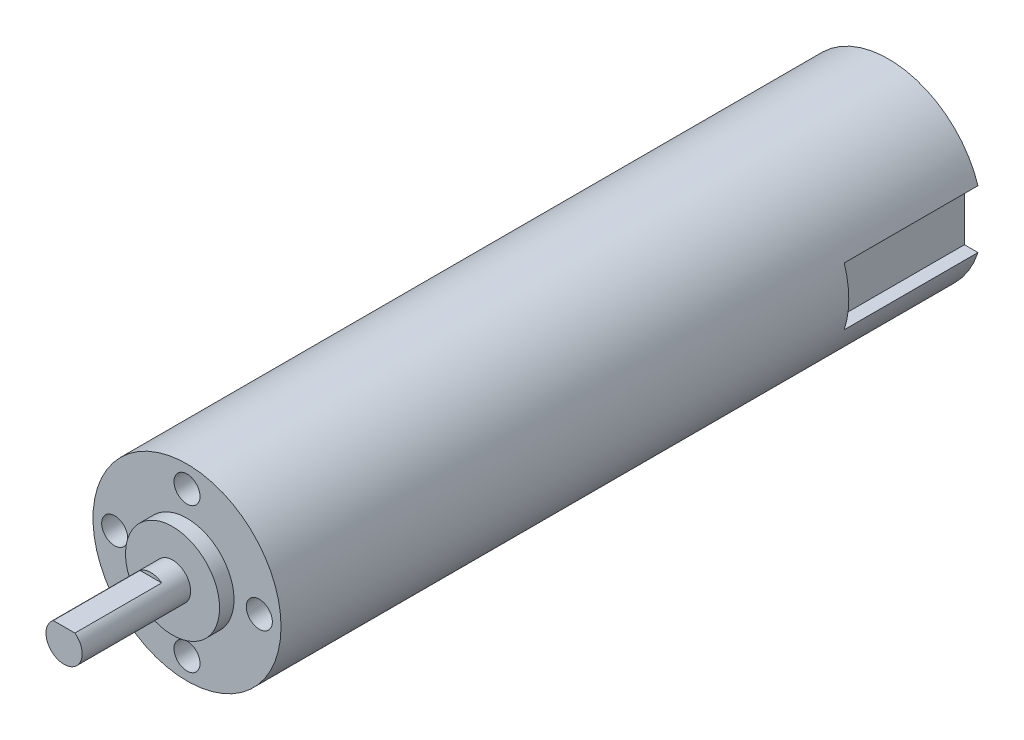
ISO-10303-21;
HEADER;
FILE_DESCRIPTION(('STEP AP214'),'2;1');
FILE_NAME('part.step','',(''),(''),'','','');
FILE_SCHEMA(('AUTOMOTIVE_DESIGN { 1 0 10303 214 1 1 1 1 }'));
ENDSEC;
DATA;
#1=APPLICATION_CONTEXT('core data for automotive mechanical design processes');
#2=APPLICATION_PROTOCOL_DEFINITION('international standard','automotive_design',2000,#1);
#3=PRODUCT_CONTEXT('',#1,'mechanical');
#4=PRODUCT('Part','Part','',(#3));
#5=PRODUCT_RELATED_PRODUCT_CATEGORY('part','',(#4));
#6=PRODUCT_DEFINITION_FORMATION('','',#4);
#7=PRODUCT_DEFINITION_CONTEXT('part definition',#1,'design');
#8=PRODUCT_DEFINITION('design','',#6,#7);
#9=PRODUCT_DEFINITION_SHAPE('','',#8);
#10=(LENGTH_UNIT() NAMED_UNIT(*) SI_UNIT(.MILLI.,.METRE.));
#11=(NAMED_UNIT(*) PLANE_ANGLE_UNIT() SI_UNIT($,.RADIAN.));
#12=(NAMED_UNIT(*) SI_UNIT($,.STERADIAN.) SOLID_ANGLE_UNIT());
#13=UNCERTAINTY_MEASURE_WITH_UNIT(LENGTH_MEASURE(1.E-05),#10,'distance_accuracy_value','');
#14=(GEOMETRIC_REPRESENTATION_CONTEXT(3) GLOBAL_UNCERTAINTY_ASSIGNED_CONTEXT((#13)) GLOBAL_UNIT_ASSIGNED_CONTEXT((#10,
#11,#12)) REPRESENTATION_CONTEXT('',''));
#15=CARTESIAN_POINT('',(0.,0.,0.));
#16=DIRECTION('',(0.,0.,1.));
#17=DIRECTION('',(1.,0.,0.));
#18=AXIS2_PLACEMENT_3D('',#15,#16,#17);
#19=CARTESIAN_POINT('',(0.,0.,100.));
#20=DIRECTION('',(0.,0.,-1.));
#21=DIRECTION('',(-1.,0.,0.));
#22=AXIS2_PLACEMENT_3D('',#19,#20,#21);
#23=CYLINDRICAL_SURFACE('',#22,2.49680534345229);
#24=CARTESIAN_POINT('',(0.,0.,100.));
#25=DIRECTION('',(0.,0.,1.));
#26=DIRECTION('',(1.,0.,0.));
#27=AXIS2_PLACEMENT_3D('',#24,#25,#26);
#28=CIRCLE('',#27,2.49680534345229);
#29=CARTESIAN_POINT('',(2.49680534345229,0.,100.));
#30=VERTEX_POINT('',#29);
#31=EDGE_CURVE('E11',#30,#30,#28,.T.);
#32=ORIENTED_EDGE('',*,*,#31,.F.);
#33=EDGE_LOOP('',(#32));
#34=FACE_BOUND('',#33,.T.);
#35=CARTESIAN_POINT('',(0.,0.,97.));
#36=DIRECTION('',(0.,0.,1.));
#37=DIRECTION('',(1.,0.,0.));
#38=AXIS2_PLACEMENT_3D('',#35,#36,#37);
#39=CIRCLE('',#38,2.49680534345229);
#40=CARTESIAN_POINT('',(2.49680534345229,0.,97.));
#41=VERTEX_POINT('',#40);
#42=EDGE_CURVE('E49',#41,#41,#39,.T.);
#43=ORIENTED_EDGE('',*,*,#42,.T.);
#44=EDGE_LOOP('',(#43));
#45=FACE_BOUND('',#44,.T.);
#46=ADVANCED_FACE('F46',(#34,#45),#23,.T.);
#47=CARTESIAN_POINT('',(0.,0.,100.));
#48=DIRECTION('',(0.,0.,1.));
#49=DIRECTION('',(1.,0.,0.));
#50=AXIS2_PLACEMENT_3D('',#47,#48,#49);
#51=PLANE('',#50);
#52=ORIENTED_EDGE('',*,*,#31,.T.);
#53=EDGE_LOOP('',(#52));
#54=FACE_BOUND('',#53,.T.);
#55=ADVANCED_FACE('F61',(#54),#51,.T.);
#56=CARTESIAN_POINT('',(0.,0.,97.));
#57=DIRECTION('',(0.,0.,1.));
#58=DIRECTION('',(1.,0.,0.));
#59=AXIS2_PLACEMENT_3D('',#56,#57,#58);
#60=PLANE('',#59);
#61=ORIENTED_EDGE('',*,*,#42,.F.);
#62=EDGE_LOOP('',(#61));
#63=FACE_BOUND('',#62,.T.);
#64=ADVANCED_FACE('F59',(#63),#60,.F.);
#65=CLOSED_SHELL('',(#46,#55,#64));
#66=MANIFOLD_SOLID_BREP('B2',#65);
#67=CARTESIAN_POINT('',(0.,0.,97.));
#68=DIRECTION('',(0.,0.,1.));
#69=DIRECTION('',(1.,0.,0.));
#70=AXIS2_PLACEMENT_3D('',#67,#68,#69);
#71=PLANE('',#70);
#72=CARTESIAN_POINT('',(0.,10.,97.));
#73=DIRECTION('',(0.,0.,1.));
#74=DIRECTION('',(1.,0.,0.));
#75=AXIS2_PLACEMENT_3D('',#72,#73,#74);
#76=CIRCLE('',#75,1.8);
#77=CARTESIAN_POINT('',(1.8,10.,97.));
#78=VERTEX_POINT('',#77);
#79=EDGE_CURVE('E191',#78,#78,#76,.T.);
#80=ORIENTED_EDGE('',*,*,#79,.F.);
#81=EDGE_LOOP('',(#80));
#82=FACE_BOUND('',#81,.T.);
#83=CARTESIAN_POINT('',(-10.,0.,97.));
#84=DIRECTION('',(0.,0.,1.));
#85=DIRECTION('',(1.,0.,0.));
#86=AXIS2_PLACEMENT_3D('',#83,#84,#85);
#87=CIRCLE('',#86,1.8);
#88=CARTESIAN_POINT('',(-8.2,0.,97.));
#89=VERTEX_POINT('',#88);
#90=EDGE_CURVE('E197',#89,#89,#87,.T.);
#91=ORIENTED_EDGE('',*,*,#90,.F.);
#92=EDGE_LOOP('',(#91));
#93=FACE_BOUND('',#92,.T.);
#94=CARTESIAN_POINT('',(0.,-10.,97.));
#95=DIRECTION('',(0.,0.,1.));
#96=DIRECTION('',(1.,0.,0.));
#97=AXIS2_PLACEMENT_3D('',#94,#95,#96);
#98=CIRCLE('',#97,1.8);
#99=CARTESIAN_POINT('',(1.8,-10.,97.));
#100=VERTEX_POINT('',#99);
#101=EDGE_CURVE('E203',#100,#100,#98,.T.);
#102=ORIENTED_EDGE('',*,*,#101,.F.);
#103=EDGE_LOOP('',(#102));
#104=FACE_BOUND('',#103,.T.);
#105=CARTESIAN_POINT('',(10.,0.,97.));
#106=DIRECTION('',(0.,0.,1.));
#107=DIRECTION('',(1.,0.,0.));
#108=AXIS2_PLACEMENT_3D('',#105,#106,#107);
#109=CIRCLE('',#108,1.8);
#110=CARTESIAN_POINT('',(11.8,0.,97.));
#111=VERTEX_POINT('',#110);
#112=EDGE_CURVE('E179',#111,#111,#109,.T.);
#113=ORIENTED_EDGE('',*,*,#112,.F.);
#114=EDGE_LOOP('',(#113));
#115=FACE_BOUND('',#114,.T.);
#116=CARTESIAN_POINT('',(0.,0.,97.));
#117=DIRECTION('',(0.,0.,1.));
#118=DIRECTION('',(1.,0.,0.));
#119=AXIS2_PLACEMENT_3D('',#116,#117,#118);
#120=CIRCLE('',#119,13.);
#121=CARTESIAN_POINT('',(13.,0.,97.));
#122=VERTEX_POINT('',#121);
#123=EDGE_CURVE('E44',#122,#122,#120,.T.);
#124=ORIENTED_EDGE('',*,*,#123,.T.);
#125=EDGE_LOOP('',(#124));
#126=FACE_BOUND('',#125,.T.);
#127=CARTESIAN_POINT('',(0.,0.,97.));
#128=DIRECTION('',(0.,0.,1.));
#129=DIRECTION('',(1.,0.,0.));
#130=AXIS2_PLACEMENT_3D('',#127,#128,#129);
#131=CIRCLE('',#130,6.5);
#132=CARTESIAN_POINT('',(6.5,0.,97.));
#133=VERTEX_POINT('',#132);
#134=EDGE_CURVE('E210',#133,#133,#131,.T.);
#135=ORIENTED_EDGE('',*,*,#134,.F.);
#136=EDGE_LOOP('',(#135));
#137=FACE_BOUND('',#136,.T.);
#138=ADVANCED_FACE('F86',(#82,#93,#104,#115,#126,#137),#71,.T.);
#139=CARTESIAN_POINT('',(0.,0.,97.));
#140=DIRECTION('',(0.,0.,-1.));
#141=DIRECTION('',(-1.,0.,0.));
#142=AXIS2_PLACEMENT_3D('',#139,#140,#141);
#143=CYLINDRICAL_SURFACE('',#142,13.);
#144=CARTESIAN_POINT('',(0.,0.,18.5));
#145=DIRECTION('',(0.,0.,-1.));
#146=DIRECTION('',(-1.,0.,0.));
#147=AXIS2_PLACEMENT_3D('',#144,#145,#146);
#148=CIRCLE('',#147,13.);
#149=CARTESIAN_POINT('',(12.369316876853,4.,18.5));
#150=VERTEX_POINT('',#149);
#151=CARTESIAN_POINT('',(12.369316876853,-4.,18.5));
#152=VERTEX_POINT('',#151);
#153=EDGE_CURVE('E217',#150,#152,#148,.T.);
#154=ORIENTED_EDGE('',*,*,#153,.F.);
#155=DIRECTION('',(0.,0.,-1.));
#156=VECTOR('',#155,1.);
#157=CARTESIAN_POINT('',(12.369316876853,4.,18.5));
#158=LINE('',#157,#156);
#159=CARTESIAN_POINT('',(12.369316876853,4.,0.));
#160=VERTEX_POINT('',#159);
#161=EDGE_CURVE('E238',#150,#160,#158,.T.);
#162=ORIENTED_EDGE('',*,*,#161,.T.);
#163=CARTESIAN_POINT('',(0.,0.,0.));
#164=DIRECTION('',(0.,0.,1.));
#165=DIRECTION('',(1.,0.,0.));
#166=AXIS2_PLACEMENT_3D('',#163,#164,#165);
#167=CIRCLE('',#166,13.);
#168=CARTESIAN_POINT('',(-12.369316876853,4.,0.));
#169=VERTEX_POINT('',#168);
#170=EDGE_CURVE('E90',#160,#169,#167,.T.);
#171=ORIENTED_EDGE('',*,*,#170,.T.);
#172=DIRECTION('',(0.,0.,-1.));
#173=VECTOR('',#172,1.);
#174=CARTESIAN_POINT('',(-12.369316876853,4.,18.5));
#175=LINE('',#174,#173);
#176=CARTESIAN_POINT('',(-12.369316876853,4.,18.5));
#177=VERTEX_POINT('',#176);
#178=EDGE_CURVE('E265',#177,#169,#175,.T.);
#179=ORIENTED_EDGE('',*,*,#178,.F.);
#180=CARTESIAN_POINT('',(0.,0.,18.5));
#181=DIRECTION('',(0.,0.,-1.));
#182=DIRECTION('',(1.,0.,0.));
#183=AXIS2_PLACEMENT_3D('',#180,#181,#182);
#184=CIRCLE('',#183,13.);
#185=CARTESIAN_POINT('',(-12.3650078174607,-4.01330059603498,18.5));
#186=VERTEX_POINT('',#185);
#187=EDGE_CURVE('E253',#186,#177,#184,.T.);
#188=ORIENTED_EDGE('',*,*,#187,.F.);
#189=DIRECTION('',(0.,0.,-1.));
#190=VECTOR('',#189,1.);
#191=CARTESIAN_POINT('',(-12.3650078174607,-4.01330059603498,18.5));
#192=LINE('',#191,#190);
#193=CARTESIAN_POINT('',(-12.3650078174607,-4.01330059603498,0.));
#194=VERTEX_POINT('',#193);
#195=EDGE_CURVE('E267',#186,#194,#192,.T.);
#196=ORIENTED_EDGE('',*,*,#195,.T.);
#197=CARTESIAN_POINT('',(12.369316876853,-4.,0.));
#198=VERTEX_POINT('',#197);
#199=EDGE_CURVE('E271',#194,#198,#167,.T.);
#200=ORIENTED_EDGE('',*,*,#199,.T.);
#201=DIRECTION('',(0.,0.,-1.));
#202=VECTOR('',#201,1.);
#203=CARTESIAN_POINT('',(12.369316876853,-4.,18.5));
#204=LINE('',#203,#202);
#205=EDGE_CURVE('E229',#152,#198,#204,.T.);
#206=ORIENTED_EDGE('',*,*,#205,.F.);
#207=EDGE_LOOP('',(#154,#162,#171,#179,#188,#196,#200,#206));
#208=FACE_BOUND('',#207,.T.);
#209=ORIENTED_EDGE('',*,*,#123,.F.);
#210=EDGE_LOOP('',(#209));
#211=FACE_BOUND('',#210,.T.);
#212=ADVANCED_FACE('F88',(#208,#211),#143,.T.);
#213=CARTESIAN_POINT('',(0.,0.,0.));
#214=DIRECTION('',(0.,0.,1.));
#215=DIRECTION('',(1.,0.,0.));
#216=AXIS2_PLACEMENT_3D('',#213,#214,#215);
#217=PLANE('',#216);
#218=ORIENTED_EDGE('',*,*,#170,.F.);
#219=DIRECTION('',(1.,0.,0.));
#220=VECTOR('',#219,1.);
#221=CARTESIAN_POINT('',(10.5,4.,0.));
#222=LINE('',#221,#220);
#223=CARTESIAN_POINT('',(10.5,4.,0.));
#224=VERTEX_POINT('',#223);
#225=EDGE_CURVE('E221',#224,#160,#222,.T.);
#226=ORIENTED_EDGE('',*,*,#225,.F.);
#227=DIRECTION('',(0.,1.,0.));
#228=VECTOR('',#227,1.);
#229=CARTESIAN_POINT('',(10.5,0.,0.));
#230=LINE('',#229,#228);
#231=CARTESIAN_POINT('',(10.5,-4.,0.));
#232=VERTEX_POINT('',#231);
#233=EDGE_CURVE('E233',#232,#224,#230,.T.);
#234=ORIENTED_EDGE('',*,*,#233,.F.);
#235=DIRECTION('',(-1.,0.,0.));
#236=VECTOR('',#235,1.);
#237=CARTESIAN_POINT('',(10.5,-4.,0.));
#238=LINE('',#237,#236);
#239=EDGE_CURVE('E230',#198,#232,#238,.T.);
#240=ORIENTED_EDGE('',*,*,#239,.F.);
#241=ORIENTED_EDGE('',*,*,#199,.F.);
#242=DIRECTION('',(-0.999974570704306,-0.00713147563547531,0.));
#243=VECTOR('',#242,1.);
#244=CARTESIAN_POINT('',(-10.5,-4.,0.));
#245=LINE('',#244,#243);
#246=CARTESIAN_POINT('',(-10.5,-4.,0.));
#247=VERTEX_POINT('',#246);
#248=EDGE_CURVE('E214',#247,#194,#245,.T.);
#249=ORIENTED_EDGE('',*,*,#248,.F.);
#250=DIRECTION('',(0.,-1.,0.));
#251=VECTOR('',#250,1.);
#252=CARTESIAN_POINT('',(-10.5,0.,0.));
#253=LINE('',#252,#251);
#254=CARTESIAN_POINT('',(-10.5,4.,0.));
#255=VERTEX_POINT('',#254);
#256=EDGE_CURVE('E250',#255,#247,#253,.T.);
#257=ORIENTED_EDGE('',*,*,#256,.F.);
#258=DIRECTION('',(1.,0.,0.));
#259=VECTOR('',#258,1.);
#260=CARTESIAN_POINT('',(-10.5,4.,0.));
#261=LINE('',#260,#259);
#262=EDGE_CURVE('E260',#169,#255,#261,.T.);
#263=ORIENTED_EDGE('',*,*,#262,.F.);
#264=EDGE_LOOP('',(#218,#226,#234,#240,#241,#249,#257,#263));
#265=FACE_BOUND('',#264,.T.);
#266=ADVANCED_FACE('F286',(#265),#217,.F.);
#267=CARTESIAN_POINT('',(-10.5,0.,18.5));
#268=DIRECTION('',(1.,0.,0.));
#269=DIRECTION('',(0.,0.,-1.));
#270=AXIS2_PLACEMENT_3D('',#267,#268,#269);
#271=PLANE('',#270);
#272=ORIENTED_EDGE('',*,*,#256,.T.);
#273=DIRECTION('',(0.,0.,-1.));
#274=VECTOR('',#273,1.);
#275=CARTESIAN_POINT('',(-10.5,-4.,18.5));
#276=LINE('',#275,#274);
#277=CARTESIAN_POINT('',(-10.5,-4.,18.5));
#278=VERTEX_POINT('',#277);
#279=EDGE_CURVE('E109',#278,#247,#276,.T.);
#280=ORIENTED_EDGE('',*,*,#279,.F.);
#281=DIRECTION('',(0.,-1.,0.));
#282=VECTOR('',#281,1.);
#283=CARTESIAN_POINT('',(-10.5,0.,18.5));
#284=LINE('',#283,#282);
#285=CARTESIAN_POINT('',(-10.5,4.,18.5));
#286=VERTEX_POINT('',#285);
#287=EDGE_CURVE('E246',#286,#278,#284,.T.);
#288=ORIENTED_EDGE('',*,*,#287,.F.);
#289=DIRECTION('',(0.,0.,-1.));
#290=VECTOR('',#289,1.);
#291=CARTESIAN_POINT('',(-10.5,4.,18.5));
#292=LINE('',#291,#290);
#293=EDGE_CURVE('E234',#286,#255,#292,.T.);
#294=ORIENTED_EDGE('',*,*,#293,.T.);
#295=EDGE_LOOP('',(#272,#280,#288,#294));
#296=FACE_BOUND('',#295,.T.);
#297=ADVANCED_FACE('F326',(#296),#271,.F.);
#298=CARTESIAN_POINT('',(-10.5,4.,18.5));
#299=DIRECTION('',(0.,1.,0.));
#300=DIRECTION('',(-1.,0.,0.));
#301=AXIS2_PLACEMENT_3D('',#298,#299,#300);
#302=PLANE('',#301);
#303=ORIENTED_EDGE('',*,*,#262,.T.);
#304=ORIENTED_EDGE('',*,*,#293,.F.);
#305=DIRECTION('',(1.,0.,0.));
#306=VECTOR('',#305,1.);
#307=CARTESIAN_POINT('',(-10.5,4.,18.5));
#308=LINE('',#307,#306);
#309=EDGE_CURVE('E256',#177,#286,#308,.T.);
#310=ORIENTED_EDGE('',*,*,#309,.F.);
#311=ORIENTED_EDGE('',*,*,#178,.T.);
#312=EDGE_LOOP('',(#303,#304,#310,#311));
#313=FACE_BOUND('',#312,.T.);
#314=ADVANCED_FACE('F292',(#313),#302,.F.);
#315=CARTESIAN_POINT('',(-10.5,-4.,18.5));
#316=DIRECTION('',(0.00713147563547531,-0.999974570704306,0.));
#317=DIRECTION('',(0.999974570704306,0.00713147563547531,0.));
#318=AXIS2_PLACEMENT_3D('',#315,#316,#317);
#319=PLANE('',#318);
#320=ORIENTED_EDGE('',*,*,#248,.T.);
#321=ORIENTED_EDGE('',*,*,#195,.F.);
#322=DIRECTION('',(-0.999974570704306,-0.00713147563547531,0.));
#323=VECTOR('',#322,1.);
#324=CARTESIAN_POINT('',(-10.5,-4.,18.5));
#325=LINE('',#324,#323);
#326=EDGE_CURVE('E249',#278,#186,#325,.T.);
#327=ORIENTED_EDGE('',*,*,#326,.F.);
#328=ORIENTED_EDGE('',*,*,#279,.T.);
#329=EDGE_LOOP('',(#320,#321,#327,#328));
#330=FACE_BOUND('',#329,.T.);
#331=ADVANCED_FACE('F335',(#330),#319,.F.);
#332=CARTESIAN_POINT('',(0.,0.,18.5));
#333=DIRECTION('',(0.,0.,1.));
#334=DIRECTION('',(1.,0.,0.));
#335=AXIS2_PLACEMENT_3D('',#332,#333,#334);
#336=PLANE('',#335);
#337=ORIENTED_EDGE('',*,*,#287,.T.);
#338=ORIENTED_EDGE('',*,*,#326,.T.);
#339=ORIENTED_EDGE('',*,*,#187,.T.);
#340=ORIENTED_EDGE('',*,*,#309,.T.);
#341=EDGE_LOOP('',(#337,#338,#339,#340));
#342=FACE_BOUND('',#341,.T.);
#343=ADVANCED_FACE('F294',(#342),#336,.F.);
#344=CARTESIAN_POINT('',(10.5,4.,18.5));
#345=DIRECTION('',(0.,1.,0.));
#346=DIRECTION('',(0.,0.,1.));
#347=AXIS2_PLACEMENT_3D('',#344,#345,#346);
#348=PLANE('',#347);
#349=ORIENTED_EDGE('',*,*,#225,.T.);
#350=ORIENTED_EDGE('',*,*,#161,.F.);
#351=DIRECTION('',(1.,0.,0.));
#352=VECTOR('',#351,1.);
#353=CARTESIAN_POINT('',(10.5,4.,18.5));
#354=LINE('',#353,#352);
#355=CARTESIAN_POINT('',(10.5,4.,18.5));
#356=VERTEX_POINT('',#355);
#357=EDGE_CURVE('E226',#356,#150,#354,.T.);
#358=ORIENTED_EDGE('',*,*,#357,.F.);
#359=DIRECTION('',(0.,0.,-1.));
#360=VECTOR('',#359,1.);
#361=CARTESIAN_POINT('',(10.5,4.,18.5));
#362=LINE('',#361,#360);
#363=EDGE_CURVE('E241',#356,#224,#362,.T.);
#364=ORIENTED_EDGE('',*,*,#363,.T.);
#365=EDGE_LOOP('',(#349,#350,#358,#364));
#366=FACE_BOUND('',#365,.T.);
#367=ADVANCED_FACE('F304',(#366),#348,.F.);
#368=CARTESIAN_POINT('',(10.5,0.,18.5));
#369=DIRECTION('',(-1.,0.,0.));
#370=DIRECTION('',(0.,0.,1.));
#371=AXIS2_PLACEMENT_3D('',#368,#369,#370);
#372=PLANE('',#371);
#373=ORIENTED_EDGE('',*,*,#233,.T.);
#374=ORIENTED_EDGE('',*,*,#363,.F.);
#375=DIRECTION('',(0.,1.,0.));
#376=VECTOR('',#375,1.);
#377=CARTESIAN_POINT('',(10.5,0.,18.5));
#378=LINE('',#377,#376);
#379=CARTESIAN_POINT('',(10.5,-4.,18.5));
#380=VERTEX_POINT('',#379);
#381=EDGE_CURVE('E224',#380,#356,#378,.T.);
#382=ORIENTED_EDGE('',*,*,#381,.F.);
#383=DIRECTION('',(0.,0.,-1.));
#384=VECTOR('',#383,1.);
#385=CARTESIAN_POINT('',(10.5,-4.,18.5));
#386=LINE('',#385,#384);
#387=EDGE_CURVE('E243',#380,#232,#386,.T.);
#388=ORIENTED_EDGE('',*,*,#387,.T.);
#389=EDGE_LOOP('',(#373,#374,#382,#388));
#390=FACE_BOUND('',#389,.T.);
#391=ADVANCED_FACE('F306',(#390),#372,.F.);
#392=CARTESIAN_POINT('',(10.5,-4.,18.5));
#393=DIRECTION('',(0.,-1.,0.));
#394=DIRECTION('',(0.,0.,-1.));
#395=AXIS2_PLACEMENT_3D('',#392,#393,#394);
#396=PLANE('',#395);
#397=ORIENTED_EDGE('',*,*,#239,.T.);
#398=ORIENTED_EDGE('',*,*,#387,.F.);
#399=DIRECTION('',(-1.,0.,0.));
#400=VECTOR('',#399,1.);
#401=CARTESIAN_POINT('',(10.5,-4.,18.5));
#402=LINE('',#401,#400);
#403=EDGE_CURVE('E220',#152,#380,#402,.T.);
#404=ORIENTED_EDGE('',*,*,#403,.F.);
#405=ORIENTED_EDGE('',*,*,#205,.T.);
#406=EDGE_LOOP('',(#397,#398,#404,#405));
#407=FACE_BOUND('',#406,.T.);
#408=ADVANCED_FACE('F297',(#407),#396,.F.);
#409=CARTESIAN_POINT('',(0.,0.,18.5));
#410=DIRECTION('',(0.,0.,-1.));
#411=DIRECTION('',(-1.,0.,0.));
#412=AXIS2_PLACEMENT_3D('',#409,#410,#411);
#413=PLANE('',#412);
#414=ORIENTED_EDGE('',*,*,#153,.T.);
#415=ORIENTED_EDGE('',*,*,#403,.T.);
#416=ORIENTED_EDGE('',*,*,#381,.T.);
#417=ORIENTED_EDGE('',*,*,#357,.T.);
#418=EDGE_LOOP('',(#414,#415,#416,#417));
#419=FACE_BOUND('',#418,.T.);
#420=ADVANCED_FACE('F300',(#419),#413,.T.);
#421=CARTESIAN_POINT('',(0.,0.,99.));
#422=DIRECTION('',(0.,0.,1.));
#423=DIRECTION('',(1.,0.,0.));
#424=AXIS2_PLACEMENT_3D('',#421,#422,#423);
#425=PLANE('',#424);
#426=CARTESIAN_POINT('',(0.,0.,99.));
#427=DIRECTION('',(0.,0.,1.));
#428=DIRECTION('',(1.,0.,0.));
#429=AXIS2_PLACEMENT_3D('',#426,#427,#428);
#430=CIRCLE('',#429,6.5);
#431=CARTESIAN_POINT('',(6.5,0.,99.));
#432=VERTEX_POINT('',#431);
#433=EDGE_CURVE('E211',#432,#432,#430,.T.);
#434=ORIENTED_EDGE('',*,*,#433,.T.);
#435=EDGE_LOOP('',(#434));
#436=FACE_BOUND('',#435,.T.);
#437=CARTESIAN_POINT('',(0.,0.,99.));
#438=DIRECTION('',(0.,0.,1.));
#439=DIRECTION('',(1.,0.,0.));
#440=AXIS2_PLACEMENT_3D('',#437,#438,#439);
#441=CIRCLE('',#440,2.5);
#442=CARTESIAN_POINT('',(2.5,0.,99.));
#443=VERTEX_POINT('',#442);
#444=EDGE_CURVE('E190',#443,#443,#441,.T.);
#445=ORIENTED_EDGE('',*,*,#444,.F.);
#446=EDGE_LOOP('',(#445));
#447=FACE_BOUND('',#446,.T.);
#448=ADVANCED_FACE('F348',(#436,#447),#425,.T.);
#449=CARTESIAN_POINT('',(0.,0.,99.));
#450=DIRECTION('',(0.,0.,-1.));
#451=DIRECTION('',(-1.,0.,0.));
#452=AXIS2_PLACEMENT_3D('',#449,#450,#451);
#453=CYLINDRICAL_SURFACE('',#452,6.5);
#454=ORIENTED_EDGE('',*,*,#433,.F.);
#455=EDGE_LOOP('',(#454));
#456=FACE_BOUND('',#455,.T.);
#457=ORIENTED_EDGE('',*,*,#134,.T.);
#458=EDGE_LOOP('',(#457));
#459=FACE_BOUND('',#458,.T.);
#460=ADVANCED_FACE('F342',(#456,#459),#453,.T.);
#461=CARTESIAN_POINT('',(0.,0.,114.));
#462=DIRECTION('',(0.,0.,1.));
#463=DIRECTION('',(1.,0.,0.));
#464=AXIS2_PLACEMENT_3D('',#461,#462,#463);
#465=PLANE('',#464);
#466=DIRECTION('',(1.,0.,0.));
#467=VECTOR('',#466,1.);
#468=CARTESIAN_POINT('',(0.,2.,114.));
#469=LINE('',#468,#467);
#470=CARTESIAN_POINT('',(-1.5,2.,114.));
#471=VERTEX_POINT('',#470);
#472=CARTESIAN_POINT('',(1.5,2.,114.));
#473=VERTEX_POINT('',#472);
#474=EDGE_CURVE('E169',#471,#473,#469,.T.);
#475=ORIENTED_EDGE('',*,*,#474,.F.);
#476=CARTESIAN_POINT('',(0.,0.,114.));
#477=DIRECTION('',(0.,0.,1.));
#478=DIRECTION('',(1.,0.,0.));
#479=AXIS2_PLACEMENT_3D('',#476,#477,#478);
#480=CIRCLE('',#479,2.5);
#481=EDGE_CURVE('E178',#471,#473,#480,.T.);
#482=ORIENTED_EDGE('',*,*,#481,.T.);
#483=EDGE_LOOP('',(#475,#482));
#484=FACE_BOUND('',#483,.T.);
#485=ADVANCED_FACE('F340',(#484),#465,.T.);
#486=CARTESIAN_POINT('',(0.,0.,114.));
#487=DIRECTION('',(0.,0.,-1.));
#488=DIRECTION('',(-1.,0.,0.));
#489=AXIS2_PLACEMENT_3D('',#486,#487,#488);
#490=CYLINDRICAL_SURFACE('',#489,2.5);
#491=ORIENTED_EDGE('',*,*,#481,.F.);
#492=DIRECTION('',(0.,0.,1.));
#493=VECTOR('',#492,1.);
#494=CARTESIAN_POINT('',(-1.5,2.,102.));
#495=LINE('',#494,#493);
#496=CARTESIAN_POINT('',(-1.5,2.,102.));
#497=VERTEX_POINT('',#496);
#498=EDGE_CURVE('E164',#497,#471,#495,.T.);
#499=ORIENTED_EDGE('',*,*,#498,.F.);
#500=CARTESIAN_POINT('',(0.,0.,102.));
#501=DIRECTION('',(0.,0.,1.));
#502=DIRECTION('',(-1.,0.,0.));
#503=AXIS2_PLACEMENT_3D('',#500,#501,#502);
#504=CIRCLE('',#503,2.5);
#505=CARTESIAN_POINT('',(1.5,2.,102.));
#506=VERTEX_POINT('',#505);
#507=EDGE_CURVE('E168',#506,#497,#504,.T.);
#508=ORIENTED_EDGE('',*,*,#507,.F.);
#509=DIRECTION('',(0.,0.,1.));
#510=VECTOR('',#509,1.);
#511=CARTESIAN_POINT('',(1.5,2.,102.));
#512=LINE('',#511,#510);
#513=EDGE_CURVE('E101',#506,#473,#512,.T.);
#514=ORIENTED_EDGE('',*,*,#513,.T.);
#515=EDGE_LOOP('',(#491,#499,#508,#514));
#516=FACE_BOUND('',#515,.T.);
#517=ORIENTED_EDGE('',*,*,#444,.T.);
#518=EDGE_LOOP('',(#517));
#519=FACE_BOUND('',#518,.T.);
#520=ADVANCED_FACE('F175',(#516,#519),#490,.T.);
#521=CARTESIAN_POINT('',(10.,0.,93.));
#522=DIRECTION('',(0.,0.,1.));
#523=DIRECTION('',(1.,0.,0.));
#524=AXIS2_PLACEMENT_3D('',#521,#522,#523);
#525=CYLINDRICAL_SURFACE('',#524,1.8);
#526=CARTESIAN_POINT('',(10.,0.,93.));
#527=DIRECTION('',(0.,0.,1.));
#528=DIRECTION('',(1.,0.,0.));
#529=AXIS2_PLACEMENT_3D('',#526,#527,#528);
#530=CIRCLE('',#529,1.8);
#531=CARTESIAN_POINT('',(11.8,0.,93.));
#532=VERTEX_POINT('',#531);
#533=EDGE_CURVE('E182',#532,#532,#530,.T.);
#534=ORIENTED_EDGE('',*,*,#533,.F.);
#535=EDGE_LOOP('',(#534));
#536=FACE_BOUND('',#535,.T.);
#537=ORIENTED_EDGE('',*,*,#112,.T.);
#538=EDGE_LOOP('',(#537));
#539=FACE_BOUND('',#538,.T.);
#540=ADVANCED_FACE('F347',(#536,#539),#525,.F.);
#541=CARTESIAN_POINT('',(10.,0.,93.));
#542=DIRECTION('',(0.,0.,1.));
#543=DIRECTION('',(1.,0.,0.));
#544=AXIS2_PLACEMENT_3D('',#541,#542,#543);
#545=PLANE('',#544);
#546=ORIENTED_EDGE('',*,*,#533,.T.);
#547=EDGE_LOOP('',(#546));
#548=FACE_BOUND('',#547,.T.);
#549=ADVANCED_FACE('F386',(#548),#545,.T.);
#550=CARTESIAN_POINT('',(0.,-10.,93.));
#551=DIRECTION('',(0.,0.,1.));
#552=DIRECTION('',(1.,0.,0.));
#553=AXIS2_PLACEMENT_3D('',#550,#551,#552);
#554=CYLINDRICAL_SURFACE('',#553,1.8);
#555=CARTESIAN_POINT('',(0.,-10.,93.));
#556=DIRECTION('',(0.,0.,1.));
#557=DIRECTION('',(1.,0.,0.));
#558=AXIS2_PLACEMENT_3D('',#555,#556,#557);
#559=CIRCLE('',#558,1.8);
#560=CARTESIAN_POINT('',(1.8,-10.,93.));
#561=VERTEX_POINT('',#560);
#562=EDGE_CURVE('E200',#561,#561,#559,.T.);
#563=ORIENTED_EDGE('',*,*,#562,.F.);
#564=EDGE_LOOP('',(#563));
#565=FACE_BOUND('',#564,.T.);
#566=ORIENTED_EDGE('',*,*,#101,.T.);
#567=EDGE_LOOP('',(#566));
#568=FACE_BOUND('',#567,.T.);
#569=ADVANCED_FACE('F395',(#565,#568),#554,.F.);
#570=CARTESIAN_POINT('',(0.,-10.,93.));
#571=DIRECTION('',(0.,0.,1.));
#572=DIRECTION('',(1.,0.,0.));
#573=AXIS2_PLACEMENT_3D('',#570,#571,#572);
#574=PLANE('',#573);
#575=ORIENTED_EDGE('',*,*,#562,.T.);
#576=EDGE_LOOP('',(#575));
#577=FACE_BOUND('',#576,.T.);
#578=ADVANCED_FACE('F405',(#577),#574,.T.);
#579=CARTESIAN_POINT('',(-10.,0.,93.));
#580=DIRECTION('',(0.,0.,1.));
#581=DIRECTION('',(1.,0.,0.));
#582=AXIS2_PLACEMENT_3D('',#579,#580,#581);
#583=CYLINDRICAL_SURFACE('',#582,1.8);
#584=CARTESIAN_POINT('',(-10.,0.,93.));
#585=DIRECTION('',(0.,0.,1.));
#586=DIRECTION('',(1.,0.,0.));
#587=AXIS2_PLACEMENT_3D('',#584,#585,#586);
#588=CIRCLE('',#587,1.8);
#589=CARTESIAN_POINT('',(-8.2,0.,93.));
#590=VERTEX_POINT('',#589);
#591=EDGE_CURVE('E194',#590,#590,#588,.T.);
#592=ORIENTED_EDGE('',*,*,#591,.F.);
#593=EDGE_LOOP('',(#592));
#594=FACE_BOUND('',#593,.T.);
#595=ORIENTED_EDGE('',*,*,#90,.T.);
#596=EDGE_LOOP('',(#595));
#597=FACE_BOUND('',#596,.T.);
#598=ADVANCED_FACE('F415',(#594,#597),#583,.F.);
#599=CARTESIAN_POINT('',(-10.,0.,93.));
#600=DIRECTION('',(0.,0.,1.));
#601=DIRECTION('',(1.,0.,0.));
#602=AXIS2_PLACEMENT_3D('',#599,#600,#601);
#603=PLANE('',#602);
#604=ORIENTED_EDGE('',*,*,#591,.T.);
#605=EDGE_LOOP('',(#604));
#606=FACE_BOUND('',#605,.T.);
#607=ADVANCED_FACE('F425',(#606),#603,.T.);
#608=CARTESIAN_POINT('',(0.,10.,93.));
#609=DIRECTION('',(0.,0.,1.));
#610=DIRECTION('',(1.,0.,0.));
#611=AXIS2_PLACEMENT_3D('',#608,#609,#610);
#612=CYLINDRICAL_SURFACE('',#611,1.8);
#613=CARTESIAN_POINT('',(0.,10.,93.));
#614=DIRECTION('',(0.,0.,1.));
#615=DIRECTION('',(1.,0.,0.));
#616=AXIS2_PLACEMENT_3D('',#613,#614,#615);
#617=CIRCLE('',#616,1.8);
#618=CARTESIAN_POINT('',(1.8,10.,93.));
#619=VERTEX_POINT('',#618);
#620=EDGE_CURVE('E187',#619,#619,#617,.T.);
#621=ORIENTED_EDGE('',*,*,#620,.F.);
#622=EDGE_LOOP('',(#621));
#623=FACE_BOUND('',#622,.T.);
#624=ORIENTED_EDGE('',*,*,#79,.T.);
#625=EDGE_LOOP('',(#624));
#626=FACE_BOUND('',#625,.T.);
#627=ADVANCED_FACE('F435',(#623,#626),#612,.F.);
#628=CARTESIAN_POINT('',(0.,10.,93.));
#629=DIRECTION('',(0.,0.,1.));
#630=DIRECTION('',(1.,0.,0.));
#631=AXIS2_PLACEMENT_3D('',#628,#629,#630);
#632=PLANE('',#631);
#633=ORIENTED_EDGE('',*,*,#620,.T.);
#634=EDGE_LOOP('',(#633));
#635=FACE_BOUND('',#634,.T.);
#636=ADVANCED_FACE('F445',(#635),#632,.T.);
#637=CARTESIAN_POINT('',(0.,2.,102.));
#638=DIRECTION('',(0.,-1.,0.));
#639=DIRECTION('',(0.,0.,-1.));
#640=AXIS2_PLACEMENT_3D('',#637,#638,#639);
#641=PLANE('',#640);
#642=ORIENTED_EDGE('',*,*,#474,.T.);
#643=ORIENTED_EDGE('',*,*,#513,.F.);
#644=DIRECTION('',(1.,0.,0.));
#645=VECTOR('',#644,1.);
#646=CARTESIAN_POINT('',(0.,2.,102.));
#647=LINE('',#646,#645);
#648=EDGE_CURVE('E160',#497,#506,#647,.T.);
#649=ORIENTED_EDGE('',*,*,#648,.F.);
#650=ORIENTED_EDGE('',*,*,#498,.T.);
#651=EDGE_LOOP('',(#642,#643,#649,#650));
#652=FACE_BOUND('',#651,.T.);
#653=ADVANCED_FACE('F162',(#652),#641,.F.);
#654=CARTESIAN_POINT('',(0.,0.,102.));
#655=DIRECTION('',(0.,0.,-1.));
#656=DIRECTION('',(-1.,0.,0.));
#657=AXIS2_PLACEMENT_3D('',#654,#655,#656);
#658=PLANE('',#657);
#659=ORIENTED_EDGE('',*,*,#648,.T.);
#660=ORIENTED_EDGE('',*,*,#507,.T.);
#661=EDGE_LOOP('',(#659,#660));
#662=FACE_BOUND('',#661,.T.);
#663=ADVANCED_FACE('F171',(#662),#658,.F.);
#664=CLOSED_SHELL('',(#138,#212,#266,#297,#314,#331,#343,#367,#391,#408,#420,#448,#460,#485,
#520,#540,#549,#569,#578,#598,#607,#627,#636,#653,#663));
#665=MANIFOLD_SOLID_BREP('B6',#664);
#666=ADVANCED_BREP_SHAPE_REPRESENTATION('',(#18,#66,#665),#14);
#667=SHAPE_DEFINITION_REPRESENTATION(#9,#666);
ENDSEC;
END-ISO-10303-21;
